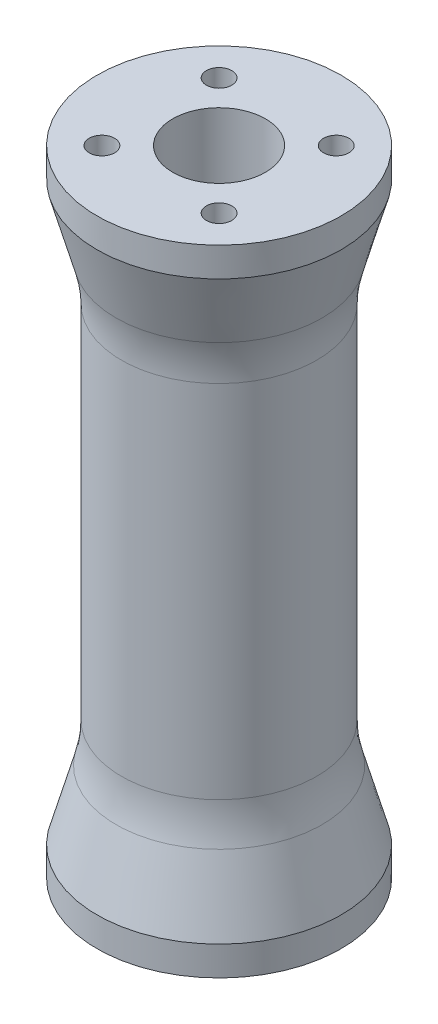
ISO-10303-21;
HEADER;
FILE_DESCRIPTION(('STEP AP214'),'2;1');
FILE_NAME('part.step','',(''),(''),'','','');
FILE_SCHEMA(('AUTOMOTIVE_DESIGN { 1 0 10303 214 1 1 1 1 }'));
ENDSEC;
DATA;
#1=APPLICATION_CONTEXT('core data for automotive mechanical design processes');
#2=APPLICATION_PROTOCOL_DEFINITION('international standard','automotive_design',2000,#1);
#3=PRODUCT_CONTEXT('',#1,'mechanical');
#4=PRODUCT('Part','Part','',(#3));
#5=PRODUCT_RELATED_PRODUCT_CATEGORY('part','',(#4));
#6=PRODUCT_DEFINITION_FORMATION('','',#4);
#7=PRODUCT_DEFINITION_CONTEXT('part definition',#1,'design');
#8=PRODUCT_DEFINITION('design','',#6,#7);
#9=PRODUCT_DEFINITION_SHAPE('','',#8);
#10=(LENGTH_UNIT() NAMED_UNIT(*) SI_UNIT(.MILLI.,.METRE.));
#11=(NAMED_UNIT(*) PLANE_ANGLE_UNIT() SI_UNIT($,.RADIAN.));
#12=(NAMED_UNIT(*) SI_UNIT($,.STERADIAN.) SOLID_ANGLE_UNIT());
#13=UNCERTAINTY_MEASURE_WITH_UNIT(LENGTH_MEASURE(1.E-05),#10,'distance_accuracy_value','');
#14=(GEOMETRIC_REPRESENTATION_CONTEXT(3) GLOBAL_UNCERTAINTY_ASSIGNED_CONTEXT((#13)) GLOBAL_UNIT_ASSIGNED_CONTEXT((#10,
#11,#12)) REPRESENTATION_CONTEXT('',''));
#15=CARTESIAN_POINT('',(0.,0.,0.));
#16=DIRECTION('',(0.,0.,1.));
#17=DIRECTION('',(1.,0.,0.));
#18=AXIS2_PLACEMENT_3D('',#15,#16,#17);
#19=CARTESIAN_POINT('',(0.,32.5,0.));
#20=DIRECTION('',(0.,-1.,0.));
#21=DIRECTION('',(0.,0.,-1.));
#22=AXIS2_PLACEMENT_3D('',#19,#20,#21);
#23=PLANE('',#22);
#24=CARTESIAN_POINT('',(0.,32.5,0.));
#25=DIRECTION('',(0.,1.,0.));
#26=DIRECTION('',(0.,0.,1.));
#27=AXIS2_PLACEMENT_3D('',#24,#25,#26);
#28=CIRCLE('',#27,4.75);
#29=CARTESIAN_POINT('',(0.,32.5,4.75));
#30=VERTEX_POINT('',#29);
#31=EDGE_CURVE('E180',#30,#30,#28,.T.);
#32=ORIENTED_EDGE('',*,*,#31,.F.);
#33=EDGE_LOOP('',(#32));
#34=FACE_BOUND('',#33,.T.);
#35=CARTESIAN_POINT('',(6.,32.5,-6.));
#36=DIRECTION('',(0.,1.,0.));
#37=DIRECTION('',(0.,0.,1.));
#38=AXIS2_PLACEMENT_3D('',#35,#36,#37);
#39=CIRCLE('',#38,1.3);
#40=CARTESIAN_POINT('',(6.,32.5,-4.7));
#41=VERTEX_POINT('',#40);
#42=EDGE_CURVE('E122',#41,#41,#39,.T.);
#43=ORIENTED_EDGE('',*,*,#42,.F.);
#44=EDGE_LOOP('',(#43));
#45=FACE_BOUND('',#44,.T.);
#46=CARTESIAN_POINT('',(-6.,32.5,6.));
#47=DIRECTION('',(0.,1.,0.));
#48=DIRECTION('',(0.,0.,1.));
#49=AXIS2_PLACEMENT_3D('',#46,#47,#48);
#50=CIRCLE('',#49,1.3);
#51=CARTESIAN_POINT('',(-6.,32.5,7.3));
#52=VERTEX_POINT('',#51);
#53=EDGE_CURVE('E129',#52,#52,#50,.T.);
#54=ORIENTED_EDGE('',*,*,#53,.F.);
#55=EDGE_LOOP('',(#54));
#56=FACE_BOUND('',#55,.T.);
#57=CARTESIAN_POINT('',(6.,32.5,6.));
#58=DIRECTION('',(0.,1.,0.));
#59=DIRECTION('',(0.,0.,1.));
#60=AXIS2_PLACEMENT_3D('',#57,#58,#59);
#61=CIRCLE('',#60,1.3);
#62=CARTESIAN_POINT('',(6.,32.5,7.3));
#63=VERTEX_POINT('',#62);
#64=EDGE_CURVE('E130',#63,#63,#61,.T.);
#65=ORIENTED_EDGE('',*,*,#64,.F.);
#66=EDGE_LOOP('',(#65));
#67=FACE_BOUND('',#66,.T.);
#68=CARTESIAN_POINT('',(-6.,32.5,-6.));
#69=DIRECTION('',(0.,1.,0.));
#70=DIRECTION('',(0.,0.,1.));
#71=AXIS2_PLACEMENT_3D('',#68,#69,#70);
#72=CIRCLE('',#71,1.3);
#73=CARTESIAN_POINT('',(-6.,32.5,-4.7));
#74=VERTEX_POINT('',#73);
#75=EDGE_CURVE('E118',#74,#74,#72,.T.);
#76=ORIENTED_EDGE('',*,*,#75,.F.);
#77=EDGE_LOOP('',(#76));
#78=FACE_BOUND('',#77,.T.);
#79=CARTESIAN_POINT('',(0.,32.5,0.));
#80=DIRECTION('',(0.,-1.,0.));
#81=DIRECTION('',(0.,0.,-1.));
#82=AXIS2_PLACEMENT_3D('',#79,#80,#81);
#83=CIRCLE('',#82,12.5);
#84=CARTESIAN_POINT('',(0.,32.5,-12.5));
#85=VERTEX_POINT('',#84);
#86=EDGE_CURVE('E95',#85,#85,#83,.T.);
#87=ORIENTED_EDGE('',*,*,#86,.F.);
#88=EDGE_LOOP('',(#87));
#89=FACE_BOUND('',#88,.T.);
#90=ADVANCED_FACE('F49',(#34,#45,#56,#67,#78,#89),#23,.F.);
#91=CARTESIAN_POINT('',(0.,-32.5,0.));
#92=DIRECTION('',(0.,-1.,0.));
#93=DIRECTION('',(0.,0.,-1.));
#94=AXIS2_PLACEMENT_3D('',#91,#92,#93);
#95=CYLINDRICAL_SURFACE('',#94,12.5);
#96=CARTESIAN_POINT('',(0.,29.5,0.));
#97=DIRECTION('',(0.,-1.,0.));
#98=DIRECTION('',(0.,0.,-1.));
#99=AXIS2_PLACEMENT_3D('',#96,#97,#98);
#100=CIRCLE('',#99,12.5);
#101=CARTESIAN_POINT('',(0.,29.5,-12.5));
#102=VERTEX_POINT('',#101);
#103=EDGE_CURVE('E105',#102,#102,#100,.T.);
#104=ORIENTED_EDGE('',*,*,#103,.F.);
#105=EDGE_LOOP('',(#104));
#106=FACE_BOUND('',#105,.T.);
#107=ORIENTED_EDGE('',*,*,#86,.T.);
#108=EDGE_LOOP('',(#107));
#109=FACE_BOUND('',#108,.T.);
#110=ADVANCED_FACE('F210',(#106,#109),#95,.T.);
#111=CARTESIAN_POINT('',(0.,29.5,0.));
#112=DIRECTION('',(0.,1.,0.));
#113=DIRECTION('',(0.,0.,1.));
#114=AXIS2_PLACEMENT_3D('',#111,#112,#113);
#115=CONICAL_SURFACE('',#114,12.5,0.270946850338424);
#116=CARTESIAN_POINT('',(0.,22.4700328799832,0.));
#117=DIRECTION('',(0.,1.,0.));
#118=DIRECTION('',(0.,0.,1.));
#119=AXIS2_PLACEMENT_3D('',#116,#117,#118);
#120=CIRCLE('',#119,10.5472313555509);
#121=CARTESIAN_POINT('',(0.,22.4700328799832,10.5472313555509));
#122=VERTEX_POINT('',#121);
#123=EDGE_CURVE('E79',#122,#122,#120,.T.);
#124=ORIENTED_EDGE('',*,*,#123,.T.);
#125=EDGE_LOOP('',(#124));
#126=FACE_BOUND('',#125,.T.);
#127=ORIENTED_EDGE('',*,*,#103,.T.);
#128=EDGE_LOOP('',(#127));
#129=FACE_BOUND('',#128,.T.);
#130=ADVANCED_FACE('F215',(#126,#129),#115,.T.);
#131=CARTESIAN_POINT('',(0.,-32.5,0.));
#132=DIRECTION('',(0.,-1.,0.));
#133=DIRECTION('',(0.,0.,-1.));
#134=AXIS2_PLACEMENT_3D('',#131,#132,#133);
#135=CYLINDRICAL_SURFACE('',#134,9.99999999999997);
#136=CARTESIAN_POINT('',(0.,-18.4553749231917,0.));
#137=DIRECTION('',(0.,-1.,0.));
#138=DIRECTION('',(0.,0.,-1.));
#139=AXIS2_PLACEMENT_3D('',#136,#137,#138);
#140=CIRCLE('',#139,9.99999999999997);
#141=CARTESIAN_POINT('',(0.,-18.4553749231917,-9.99999999999997));
#142=VERTEX_POINT('',#141);
#143=EDGE_CURVE('E83',#142,#142,#140,.F.);
#144=ORIENTED_EDGE('',*,*,#143,.T.);
#145=EDGE_LOOP('',(#144));
#146=FACE_BOUND('',#145,.T.);
#147=CARTESIAN_POINT('',(0.,18.4553749231917,0.));
#148=DIRECTION('',(0.,-1.,0.));
#149=DIRECTION('',(0.,0.,-1.));
#150=AXIS2_PLACEMENT_3D('',#147,#148,#149);
#151=CIRCLE('',#150,9.99999999999997);
#152=CARTESIAN_POINT('',(0.,18.4553749231917,-9.99999999999997));
#153=VERTEX_POINT('',#152);
#154=EDGE_CURVE('E87',#153,#153,#151,.T.);
#155=ORIENTED_EDGE('',*,*,#154,.T.);
#156=EDGE_LOOP('',(#155));
#157=FACE_BOUND('',#156,.T.);
#158=ADVANCED_FACE('F292',(#146,#157),#135,.T.);
#159=CARTESIAN_POINT('',(0.,-20.5,0.));
#160=DIRECTION('',(0.,-1.,0.));
#161=DIRECTION('',(0.,0.,-1.));
#162=AXIS2_PLACEMENT_3D('',#159,#160,#161);
#163=CONICAL_SURFACE('',#162,9.99999999999997,0.270946850338424);
#164=CARTESIAN_POINT('',(0.,-22.4700328799832,0.));
#165=DIRECTION('',(0.,-1.,0.));
#166=DIRECTION('',(0.,0.,-1.));
#167=AXIS2_PLACEMENT_3D('',#164,#165,#166);
#168=CIRCLE('',#167,10.5472313555509);
#169=CARTESIAN_POINT('',(0.,-22.4700328799832,-10.5472313555509));
#170=VERTEX_POINT('',#169);
#171=EDGE_CURVE('E91',#170,#170,#168,.T.);
#172=ORIENTED_EDGE('',*,*,#171,.T.);
#173=EDGE_LOOP('',(#172));
#174=FACE_BOUND('',#173,.T.);
#175=CARTESIAN_POINT('',(0.,-29.5,0.));
#176=DIRECTION('',(0.,-1.,0.));
#177=DIRECTION('',(0.,0.,-1.));
#178=AXIS2_PLACEMENT_3D('',#175,#176,#177);
#179=CIRCLE('',#178,12.5);
#180=CARTESIAN_POINT('',(0.,-29.5,-12.5));
#181=VERTEX_POINT('',#180);
#182=EDGE_CURVE('E109',#181,#181,#179,.T.);
#183=ORIENTED_EDGE('',*,*,#182,.F.);
#184=EDGE_LOOP('',(#183));
#185=FACE_BOUND('',#184,.T.);
#186=ADVANCED_FACE('F286',(#174,#185),#163,.T.);
#187=CARTESIAN_POINT('',(0.,-32.5,0.));
#188=DIRECTION('',(0.,-1.,0.));
#189=DIRECTION('',(0.,0.,-1.));
#190=AXIS2_PLACEMENT_3D('',#187,#188,#189);
#191=CYLINDRICAL_SURFACE('',#190,12.5);
#192=CARTESIAN_POINT('',(0.,-32.5,0.));
#193=DIRECTION('',(0.,-1.,0.));
#194=DIRECTION('',(0.,0.,-1.));
#195=AXIS2_PLACEMENT_3D('',#192,#193,#194);
#196=CIRCLE('',#195,12.5);
#197=CARTESIAN_POINT('',(0.,-32.5,-12.5));
#198=VERTEX_POINT('',#197);
#199=EDGE_CURVE('E113',#198,#198,#196,.T.);
#200=ORIENTED_EDGE('',*,*,#199,.F.);
#201=EDGE_LOOP('',(#200));
#202=FACE_BOUND('',#201,.T.);
#203=ORIENTED_EDGE('',*,*,#182,.T.);
#204=EDGE_LOOP('',(#203));
#205=FACE_BOUND('',#204,.T.);
#206=ADVANCED_FACE('F291',(#202,#205),#191,.T.);
#207=CARTESIAN_POINT('',(0.,-32.5,0.));
#208=DIRECTION('',(0.,1.,0.));
#209=DIRECTION('',(0.,0.,1.));
#210=AXIS2_PLACEMENT_3D('',#207,#208,#209);
#211=PLANE('',#210);
#212=CARTESIAN_POINT('',(0.,-32.5,0.));
#213=DIRECTION('',(0.,1.,0.));
#214=DIRECTION('',(0.,0.,1.));
#215=AXIS2_PLACEMENT_3D('',#212,#213,#214);
#216=CIRCLE('',#215,4.75);
#217=CARTESIAN_POINT('',(0.,-32.5,4.75));
#218=VERTEX_POINT('',#217);
#219=EDGE_CURVE('E101',#218,#218,#216,.T.);
#220=ORIENTED_EDGE('',*,*,#219,.T.);
#221=EDGE_LOOP('',(#220));
#222=FACE_BOUND('',#221,.T.);
#223=CARTESIAN_POINT('',(6.,-32.5,-6.));
#224=DIRECTION('',(0.,1.,0.));
#225=DIRECTION('',(0.,0.,1.));
#226=AXIS2_PLACEMENT_3D('',#223,#224,#225);
#227=CIRCLE('',#226,1.3);
#228=CARTESIAN_POINT('',(6.,-32.5,-4.7));
#229=VERTEX_POINT('',#228);
#230=EDGE_CURVE('E165',#229,#229,#227,.T.);
#231=ORIENTED_EDGE('',*,*,#230,.T.);
#232=EDGE_LOOP('',(#231));
#233=FACE_BOUND('',#232,.T.);
#234=CARTESIAN_POINT('',(-6.,-32.5,6.));
#235=DIRECTION('',(0.,1.,0.));
#236=DIRECTION('',(0.,0.,1.));
#237=AXIS2_PLACEMENT_3D('',#234,#235,#236);
#238=CIRCLE('',#237,1.3);
#239=CARTESIAN_POINT('',(-6.,-32.5,7.3));
#240=VERTEX_POINT('',#239);
#241=EDGE_CURVE('E157',#240,#240,#238,.T.);
#242=ORIENTED_EDGE('',*,*,#241,.T.);
#243=EDGE_LOOP('',(#242));
#244=FACE_BOUND('',#243,.T.);
#245=CARTESIAN_POINT('',(6.,-32.5,6.));
#246=DIRECTION('',(0.,1.,0.));
#247=DIRECTION('',(0.,0.,1.));
#248=AXIS2_PLACEMENT_3D('',#245,#246,#247);
#249=CIRCLE('',#248,1.3);
#250=CARTESIAN_POINT('',(6.,-32.5,7.3));
#251=VERTEX_POINT('',#250);
#252=EDGE_CURVE('E171',#251,#251,#249,.T.);
#253=ORIENTED_EDGE('',*,*,#252,.T.);
#254=EDGE_LOOP('',(#253));
#255=FACE_BOUND('',#254,.T.);
#256=CARTESIAN_POINT('',(-6.,-32.5,-6.));
#257=DIRECTION('',(0.,1.,0.));
#258=DIRECTION('',(0.,0.,1.));
#259=AXIS2_PLACEMENT_3D('',#256,#257,#258);
#260=CIRCLE('',#259,1.3);
#261=CARTESIAN_POINT('',(-6.,-32.5,-4.7));
#262=VERTEX_POINT('',#261);
#263=EDGE_CURVE('E149',#262,#262,#260,.T.);
#264=ORIENTED_EDGE('',*,*,#263,.T.);
#265=EDGE_LOOP('',(#264));
#266=FACE_BOUND('',#265,.T.);
#267=ORIENTED_EDGE('',*,*,#199,.T.);
#268=EDGE_LOOP('',(#267));
#269=FACE_BOUND('',#268,.T.);
#270=ADVANCED_FACE('F189',(#222,#233,#244,#255,#266,#269),#211,.F.);
#271=CARTESIAN_POINT('',(-6.,25.5,-6.));
#272=DIRECTION('',(0.,1.,0.));
#273=DIRECTION('',(0.,0.,1.));
#274=AXIS2_PLACEMENT_3D('',#271,#272,#273);
#275=CYLINDRICAL_SURFACE('',#274,1.3);
#276=CARTESIAN_POINT('',(-6.,25.5,-6.));
#277=DIRECTION('',(0.,1.,0.));
#278=DIRECTION('',(0.,0.,1.));
#279=AXIS2_PLACEMENT_3D('',#276,#277,#278);
#280=CIRCLE('',#279,1.3);
#281=CARTESIAN_POINT('',(-6.,25.5,-4.7));
#282=VERTEX_POINT('',#281);
#283=EDGE_CURVE('E117',#282,#282,#280,.T.);
#284=ORIENTED_EDGE('',*,*,#283,.F.);
#285=EDGE_LOOP('',(#284));
#286=FACE_BOUND('',#285,.T.);
#287=ORIENTED_EDGE('',*,*,#75,.T.);
#288=EDGE_LOOP('',(#287));
#289=FACE_BOUND('',#288,.T.);
#290=ADVANCED_FACE('F335',(#286,#289),#275,.F.);
#291=CARTESIAN_POINT('',(-6.,25.5,-6.));
#292=DIRECTION('',(0.,1.,0.));
#293=DIRECTION('',(0.,0.,1.));
#294=AXIS2_PLACEMENT_3D('',#291,#292,#293);
#295=PLANE('',#294);
#296=ORIENTED_EDGE('',*,*,#283,.T.);
#297=EDGE_LOOP('',(#296));
#298=FACE_BOUND('',#297,.T.);
#299=ADVANCED_FACE('F479',(#298),#295,.T.);
#300=CARTESIAN_POINT('',(6.,25.5,6.));
#301=DIRECTION('',(0.,1.,0.));
#302=DIRECTION('',(0.,0.,1.));
#303=AXIS2_PLACEMENT_3D('',#300,#301,#302);
#304=CYLINDRICAL_SURFACE('',#303,1.3);
#305=CARTESIAN_POINT('',(6.,25.5,6.));
#306=DIRECTION('',(0.,1.,0.));
#307=DIRECTION('',(0.,0.,1.));
#308=AXIS2_PLACEMENT_3D('',#305,#306,#307);
#309=CIRCLE('',#308,1.3);
#310=CARTESIAN_POINT('',(6.,25.5,7.3));
#311=VERTEX_POINT('',#310);
#312=EDGE_CURVE('E141',#311,#311,#309,.T.);
#313=ORIENTED_EDGE('',*,*,#312,.F.);
#314=EDGE_LOOP('',(#313));
#315=FACE_BOUND('',#314,.T.);
#316=ORIENTED_EDGE('',*,*,#64,.T.);
#317=EDGE_LOOP('',(#316));
#318=FACE_BOUND('',#317,.T.);
#319=ADVANCED_FACE('F469',(#315,#318),#304,.F.);
#320=CARTESIAN_POINT('',(6.,25.5,6.));
#321=DIRECTION('',(0.,1.,0.));
#322=DIRECTION('',(0.,0.,1.));
#323=AXIS2_PLACEMENT_3D('',#320,#321,#322);
#324=PLANE('',#323);
#325=ORIENTED_EDGE('',*,*,#312,.T.);
#326=EDGE_LOOP('',(#325));
#327=FACE_BOUND('',#326,.T.);
#328=ADVANCED_FACE('F459',(#327),#324,.T.);
#329=CARTESIAN_POINT('',(-6.,25.5,6.));
#330=DIRECTION('',(0.,1.,0.));
#331=DIRECTION('',(0.,0.,1.));
#332=AXIS2_PLACEMENT_3D('',#329,#330,#331);
#333=CYLINDRICAL_SURFACE('',#332,1.3);
#334=CARTESIAN_POINT('',(-6.,25.5,6.));
#335=DIRECTION('',(0.,1.,0.));
#336=DIRECTION('',(0.,0.,1.));
#337=AXIS2_PLACEMENT_3D('',#334,#335,#336);
#338=CIRCLE('',#337,1.3);
#339=CARTESIAN_POINT('',(-6.,25.5,7.3));
#340=VERTEX_POINT('',#339);
#341=EDGE_CURVE('E126',#340,#340,#338,.T.);
#342=ORIENTED_EDGE('',*,*,#341,.F.);
#343=EDGE_LOOP('',(#342));
#344=FACE_BOUND('',#343,.T.);
#345=ORIENTED_EDGE('',*,*,#53,.T.);
#346=EDGE_LOOP('',(#345));
#347=FACE_BOUND('',#346,.T.);
#348=ADVANCED_FACE('F449',(#344,#347),#333,.F.);
#349=CARTESIAN_POINT('',(-6.,25.5,6.));
#350=DIRECTION('',(0.,1.,0.));
#351=DIRECTION('',(0.,0.,1.));
#352=AXIS2_PLACEMENT_3D('',#349,#350,#351);
#353=PLANE('',#352);
#354=ORIENTED_EDGE('',*,*,#341,.T.);
#355=EDGE_LOOP('',(#354));
#356=FACE_BOUND('',#355,.T.);
#357=ADVANCED_FACE('F439',(#356),#353,.T.);
#358=CARTESIAN_POINT('',(6.,25.5,-6.));
#359=DIRECTION('',(0.,1.,0.));
#360=DIRECTION('',(0.,0.,1.));
#361=AXIS2_PLACEMENT_3D('',#358,#359,#360);
#362=CYLINDRICAL_SURFACE('',#361,1.3);
#363=CARTESIAN_POINT('',(6.,25.5,-6.));
#364=DIRECTION('',(0.,1.,0.));
#365=DIRECTION('',(0.,0.,1.));
#366=AXIS2_PLACEMENT_3D('',#363,#364,#365);
#367=CIRCLE('',#366,1.3);
#368=CARTESIAN_POINT('',(6.,25.5,-4.7));
#369=VERTEX_POINT('',#368);
#370=EDGE_CURVE('E134',#369,#369,#367,.T.);
#371=ORIENTED_EDGE('',*,*,#370,.F.);
#372=EDGE_LOOP('',(#371));
#373=FACE_BOUND('',#372,.T.);
#374=ORIENTED_EDGE('',*,*,#42,.T.);
#375=EDGE_LOOP('',(#374));
#376=FACE_BOUND('',#375,.T.);
#377=ADVANCED_FACE('F429',(#373,#376),#362,.F.);
#378=CARTESIAN_POINT('',(6.,25.5,-6.));
#379=DIRECTION('',(0.,1.,0.));
#380=DIRECTION('',(0.,0.,1.));
#381=AXIS2_PLACEMENT_3D('',#378,#379,#380);
#382=PLANE('',#381);
#383=ORIENTED_EDGE('',*,*,#370,.T.);
#384=EDGE_LOOP('',(#383));
#385=FACE_BOUND('',#384,.T.);
#386=ADVANCED_FACE('F419',(#385),#382,.T.);
#387=CARTESIAN_POINT('',(-6.,-25.5,-6.));
#388=DIRECTION('',(0.,-1.,0.));
#389=DIRECTION('',(0.,0.,-1.));
#390=AXIS2_PLACEMENT_3D('',#387,#388,#389);
#391=CYLINDRICAL_SURFACE('',#390,1.3);
#392=CARTESIAN_POINT('',(-6.,-25.5,-6.));
#393=DIRECTION('',(0.,1.,0.));
#394=DIRECTION('',(0.,0.,1.));
#395=AXIS2_PLACEMENT_3D('',#392,#393,#394);
#396=CIRCLE('',#395,1.3);
#397=CARTESIAN_POINT('',(-6.,-25.5,-4.7));
#398=VERTEX_POINT('',#397);
#399=EDGE_CURVE('E145',#398,#398,#396,.T.);
#400=ORIENTED_EDGE('',*,*,#399,.T.);
#401=EDGE_LOOP('',(#400));
#402=FACE_BOUND('',#401,.T.);
#403=ORIENTED_EDGE('',*,*,#263,.F.);
#404=EDGE_LOOP('',(#403));
#405=FACE_BOUND('',#404,.T.);
#406=ADVANCED_FACE('F409',(#402,#405),#391,.F.);
#407=CARTESIAN_POINT('',(-6.,-25.5,-6.));
#408=DIRECTION('',(0.,-1.,0.));
#409=DIRECTION('',(0.,0.,1.));
#410=AXIS2_PLACEMENT_3D('',#407,#408,#409);
#411=PLANE('',#410);
#412=ORIENTED_EDGE('',*,*,#399,.F.);
#413=EDGE_LOOP('',(#412));
#414=FACE_BOUND('',#413,.T.);
#415=ADVANCED_FACE('F399',(#414),#411,.T.);
#416=CARTESIAN_POINT('',(6.,-25.5,6.));
#417=DIRECTION('',(0.,-1.,0.));
#418=DIRECTION('',(0.,0.,-1.));
#419=AXIS2_PLACEMENT_3D('',#416,#417,#418);
#420=CYLINDRICAL_SURFACE('',#419,1.3);
#421=CARTESIAN_POINT('',(6.,-25.5,6.));
#422=DIRECTION('',(0.,1.,0.));
#423=DIRECTION('',(0.,0.,1.));
#424=AXIS2_PLACEMENT_3D('',#421,#422,#423);
#425=CIRCLE('',#424,1.3);
#426=CARTESIAN_POINT('',(6.,-25.5,7.3));
#427=VERTEX_POINT('',#426);
#428=EDGE_CURVE('E162',#427,#427,#425,.T.);
#429=ORIENTED_EDGE('',*,*,#428,.T.);
#430=EDGE_LOOP('',(#429));
#431=FACE_BOUND('',#430,.T.);
#432=ORIENTED_EDGE('',*,*,#252,.F.);
#433=EDGE_LOOP('',(#432));
#434=FACE_BOUND('',#433,.T.);
#435=ADVANCED_FACE('F390',(#431,#434),#420,.F.);
#436=CARTESIAN_POINT('',(6.,-25.5,6.));
#437=DIRECTION('',(0.,-1.,0.));
#438=DIRECTION('',(0.,0.,1.));
#439=AXIS2_PLACEMENT_3D('',#436,#437,#438);
#440=PLANE('',#439);
#441=ORIENTED_EDGE('',*,*,#428,.F.);
#442=EDGE_LOOP('',(#441));
#443=FACE_BOUND('',#442,.T.);
#444=ADVANCED_FACE('F380',(#443),#440,.T.);
#445=CARTESIAN_POINT('',(-6.,-25.5,6.));
#446=DIRECTION('',(0.,-1.,0.));
#447=DIRECTION('',(0.,0.,-1.));
#448=AXIS2_PLACEMENT_3D('',#445,#446,#447);
#449=CYLINDRICAL_SURFACE('',#448,1.3);
#450=CARTESIAN_POINT('',(-6.,-25.5,6.));
#451=DIRECTION('',(0.,1.,0.));
#452=DIRECTION('',(0.,0.,1.));
#453=AXIS2_PLACEMENT_3D('',#450,#451,#452);
#454=CIRCLE('',#453,1.3);
#455=CARTESIAN_POINT('',(-6.,-25.5,7.3));
#456=VERTEX_POINT('',#455);
#457=EDGE_CURVE('E161',#456,#456,#454,.T.);
#458=ORIENTED_EDGE('',*,*,#457,.T.);
#459=EDGE_LOOP('',(#458));
#460=FACE_BOUND('',#459,.T.);
#461=ORIENTED_EDGE('',*,*,#241,.F.);
#462=EDGE_LOOP('',(#461));
#463=FACE_BOUND('',#462,.T.);
#464=ADVANCED_FACE('F370',(#460,#463),#449,.F.);
#465=CARTESIAN_POINT('',(-6.,-25.5,6.));
#466=DIRECTION('',(0.,-1.,0.));
#467=DIRECTION('',(0.,0.,1.));
#468=AXIS2_PLACEMENT_3D('',#465,#466,#467);
#469=PLANE('',#468);
#470=ORIENTED_EDGE('',*,*,#457,.F.);
#471=EDGE_LOOP('',(#470));
#472=FACE_BOUND('',#471,.T.);
#473=ADVANCED_FACE('F360',(#472),#469,.T.);
#474=CARTESIAN_POINT('',(6.,-25.5,-6.));
#475=DIRECTION('',(0.,-1.,0.));
#476=DIRECTION('',(0.,0.,-1.));
#477=AXIS2_PLACEMENT_3D('',#474,#475,#476);
#478=CYLINDRICAL_SURFACE('',#477,1.3);
#479=CARTESIAN_POINT('',(6.,-25.5,-6.));
#480=DIRECTION('',(0.,1.,0.));
#481=DIRECTION('',(0.,0.,1.));
#482=AXIS2_PLACEMENT_3D('',#479,#480,#481);
#483=CIRCLE('',#482,1.3);
#484=CARTESIAN_POINT('',(6.,-25.5,-4.7));
#485=VERTEX_POINT('',#484);
#486=EDGE_CURVE('E153',#485,#485,#483,.T.);
#487=ORIENTED_EDGE('',*,*,#486,.T.);
#488=EDGE_LOOP('',(#487));
#489=FACE_BOUND('',#488,.T.);
#490=ORIENTED_EDGE('',*,*,#230,.F.);
#491=EDGE_LOOP('',(#490));
#492=FACE_BOUND('',#491,.T.);
#493=ADVANCED_FACE('F350',(#489,#492),#478,.F.);
#494=CARTESIAN_POINT('',(6.,-25.5,-6.));
#495=DIRECTION('',(0.,-1.,0.));
#496=DIRECTION('',(0.,0.,1.));
#497=AXIS2_PLACEMENT_3D('',#494,#495,#496);
#498=PLANE('',#497);
#499=ORIENTED_EDGE('',*,*,#486,.F.);
#500=EDGE_LOOP('',(#499));
#501=FACE_BOUND('',#500,.T.);
#502=ADVANCED_FACE('F326',(#501),#498,.T.);
#503=CARTESIAN_POINT('',(0.,-32.5,0.));
#504=DIRECTION('',(0.,1.,0.));
#505=DIRECTION('',(0.,0.,1.));
#506=AXIS2_PLACEMENT_3D('',#503,#504,#505);
#507=CYLINDRICAL_SURFACE('',#506,4.75);
#508=ORIENTED_EDGE('',*,*,#31,.T.);
#509=EDGE_LOOP('',(#508));
#510=FACE_BOUND('',#509,.T.);
#511=CARTESIAN_POINT('',(0.,24.95,0.));
#512=DIRECTION('',(0.,-1.,0.));
#513=DIRECTION('',(1.,0.,0.));
#514=AXIS2_PLACEMENT_3D('',#511,#512,#513);
#515=CIRCLE('',#514,4.75);
#516=CARTESIAN_POINT('',(4.75,24.95,0.));
#517=VERTEX_POINT('',#516);
#518=EDGE_CURVE('E96',#517,#517,#515,.F.);
#519=ORIENTED_EDGE('',*,*,#518,.F.);
#520=EDGE_LOOP('',(#519));
#521=FACE_BOUND('',#520,.T.);
#522=ADVANCED_FACE('F196',(#510,#521),#507,.F.);
#523=ORIENTED_EDGE('',*,*,#219,.F.);
#524=EDGE_LOOP('',(#523));
#525=FACE_BOUND('',#524,.T.);
#526=CARTESIAN_POINT('',(0.,-24.95,0.));
#527=DIRECTION('',(0.,1.,0.));
#528=DIRECTION('',(-1.,0.,0.));
#529=AXIS2_PLACEMENT_3D('',#526,#527,#528);
#530=CIRCLE('',#529,4.75);
#531=CARTESIAN_POINT('',(-4.74999999999999,-24.95,0.));
#532=VERTEX_POINT('',#531);
#533=EDGE_CURVE('E100',#532,#532,#530,.F.);
#534=ORIENTED_EDGE('',*,*,#533,.F.);
#535=EDGE_LOOP('',(#534));
#536=FACE_BOUND('',#535,.T.);
#537=ADVANCED_FACE('F192',(#525,#536),#507,.F.);
#538=CARTESIAN_POINT('',(0.,-20.7,0.));
#539=DIRECTION('',(0.,1.,0.));
#540=DIRECTION('',(-1.,0.,0.));
#541=AXIS2_PLACEMENT_3D('',#538,#539,#540);
#542=CONICAL_SURFACE('',#541,8.99999999999997,0.785398163397446);
#543=CARTESIAN_POINT('',(0.,-21.8715728752538,0.));
#544=DIRECTION('',(0.,1.,0.));
#545=DIRECTION('',(-1.,0.,0.));
#546=AXIS2_PLACEMENT_3D('',#543,#544,#545);
#547=CIRCLE('',#546,7.82842712474617);
#548=CARTESIAN_POINT('',(-7.82842712474616,-21.8715728752538,0.));
#549=VERTEX_POINT('',#548);
#550=EDGE_CURVE('E73',#549,#549,#547,.T.);
#551=ORIENTED_EDGE('',*,*,#550,.T.);
#552=EDGE_LOOP('',(#551));
#553=FACE_BOUND('',#552,.T.);
#554=ORIENTED_EDGE('',*,*,#533,.T.);
#555=EDGE_LOOP('',(#554));
#556=FACE_BOUND('',#555,.T.);
#557=ADVANCED_FACE('F195',(#553,#556),#542,.F.);
#558=CARTESIAN_POINT('',(0.,29.7,0.));
#559=DIRECTION('',(0.,1.,0.));
#560=DIRECTION('',(-1.,0.,0.));
#561=AXIS2_PLACEMENT_3D('',#558,#559,#560);
#562=CYLINDRICAL_SURFACE('',#561,8.99999999999997);
#563=CARTESIAN_POINT('',(0.,-19.0431457505076,0.));
#564=DIRECTION('',(0.,1.,0.));
#565=DIRECTION('',(-1.,0.,0.));
#566=AXIS2_PLACEMENT_3D('',#563,#564,#565);
#567=CIRCLE('',#566,8.99999999999997);
#568=CARTESIAN_POINT('',(-8.99999999999996,-19.0431457505076,0.));
#569=VERTEX_POINT('',#568);
#570=EDGE_CURVE('E57',#569,#569,#567,.F.);
#571=ORIENTED_EDGE('',*,*,#570,.T.);
#572=EDGE_LOOP('',(#571));
#573=FACE_BOUND('',#572,.T.);
#574=CARTESIAN_POINT('',(0.,19.0431457505076,0.));
#575=DIRECTION('',(0.,1.,0.));
#576=DIRECTION('',(-1.,0.,0.));
#577=AXIS2_PLACEMENT_3D('',#574,#575,#576);
#578=CIRCLE('',#577,8.99999999999997);
#579=CARTESIAN_POINT('',(-8.99999999999997,19.0431457505076,0.));
#580=VERTEX_POINT('',#579);
#581=EDGE_CURVE('E65',#580,#580,#578,.T.);
#582=ORIENTED_EDGE('',*,*,#581,.T.);
#583=EDGE_LOOP('',(#582));
#584=FACE_BOUND('',#583,.T.);
#585=ADVANCED_FACE('F201',(#573,#584),#562,.F.);
#586=CARTESIAN_POINT('',(0.,29.7,0.));
#587=DIRECTION('',(0.,-1.,0.));
#588=DIRECTION('',(1.,0.,0.));
#589=AXIS2_PLACEMENT_3D('',#586,#587,#588);
#590=CONICAL_SURFACE('',#589,0.,0.785398163397446);
#591=CARTESIAN_POINT('',(0.,21.8715728752538,0.));
#592=DIRECTION('',(0.,-1.,0.));
#593=DIRECTION('',(1.,0.,0.));
#594=AXIS2_PLACEMENT_3D('',#591,#592,#593);
#595=CIRCLE('',#594,7.82842712474617);
#596=CARTESIAN_POINT('',(7.82842712474617,21.8715728752538,0.));
#597=VERTEX_POINT('',#596);
#598=EDGE_CURVE('E10',#597,#597,#595,.T.);
#599=ORIENTED_EDGE('',*,*,#598,.T.);
#600=EDGE_LOOP('',(#599));
#601=FACE_BOUND('',#600,.T.);
#602=ORIENTED_EDGE('',*,*,#518,.T.);
#603=EDGE_LOOP('',(#602));
#604=FACE_BOUND('',#603,.T.);
#605=ADVANCED_FACE('F206',(#601,#604),#590,.F.);
#606=CARTESIAN_POINT('',(0.,-18.4553749231917,0.));
#607=DIRECTION('',(0.,-1.,0.));
#608=DIRECTION('',(0.,0.,-1.));
#609=AXIS2_PLACEMENT_3D('',#606,#607,#608);
#610=TOROIDAL_SURFACE('',#609,25.,15.);
#611=ORIENTED_EDGE('',*,*,#143,.F.);
#612=EDGE_LOOP('',(#611));
#613=FACE_BOUND('',#612,.T.);
#614=ORIENTED_EDGE('',*,*,#171,.F.);
#615=EDGE_LOOP('',(#614));
#616=FACE_BOUND('',#615,.T.);
#617=ADVANCED_FACE('F222',(#613,#616),#610,.F.);
#618=CARTESIAN_POINT('',(0.,18.4553749231917,0.));
#619=DIRECTION('',(0.,-1.,0.));
#620=DIRECTION('',(0.,0.,-1.));
#621=AXIS2_PLACEMENT_3D('',#618,#619,#620);
#622=TOROIDAL_SURFACE('',#621,25.,15.);
#623=ORIENTED_EDGE('',*,*,#123,.F.);
#624=EDGE_LOOP('',(#623));
#625=FACE_BOUND('',#624,.T.);
#626=ORIENTED_EDGE('',*,*,#154,.F.);
#627=EDGE_LOOP('',(#626));
#628=FACE_BOUND('',#627,.T.);
#629=ADVANCED_FACE('F225',(#625,#628),#622,.F.);
#630=CARTESIAN_POINT('',(0.,-19.0431457505076,0.));
#631=DIRECTION('',(0.,1.,0.));
#632=DIRECTION('',(-1.,0.,0.));
#633=AXIS2_PLACEMENT_3D('',#630,#631,#632);
#634=TOROIDAL_SURFACE('',#633,4.99999999999997,4.);
#635=ORIENTED_EDGE('',*,*,#570,.F.);
#636=EDGE_LOOP('',(#635));
#637=FACE_BOUND('',#636,.T.);
#638=ORIENTED_EDGE('',*,*,#550,.F.);
#639=EDGE_LOOP('',(#638));
#640=FACE_BOUND('',#639,.T.);
#641=ADVANCED_FACE('F228',(#637,#640),#634,.F.);
#642=CARTESIAN_POINT('',(0.,19.0431457505076,0.));
#643=DIRECTION('',(0.,1.,0.));
#644=DIRECTION('',(-1.,0.,0.));
#645=AXIS2_PLACEMENT_3D('',#642,#643,#644);
#646=TOROIDAL_SURFACE('',#645,4.99999999999997,4.);
#647=ORIENTED_EDGE('',*,*,#598,.F.);
#648=EDGE_LOOP('',(#647));
#649=FACE_BOUND('',#648,.T.);
#650=ORIENTED_EDGE('',*,*,#581,.F.);
#651=EDGE_LOOP('',(#650));
#652=FACE_BOUND('',#651,.T.);
#653=ADVANCED_FACE('F51',(#649,#652),#646,.F.);
#654=CLOSED_SHELL('',(#90,#110,#130,#158,#186,#206,#270,#290,#299,#319,#328,#348,#357,#377,#386,
#406,#415,#435,#444,#464,#473,#493,#502,#522,#537,#557,#585,#605,#617,#629,#641,#653));
#655=MANIFOLD_SOLID_BREP('B2',#654);
#656=ADVANCED_BREP_SHAPE_REPRESENTATION('',(#18,#655),#14);
#657=SHAPE_DEFINITION_REPRESENTATION(#9,#656);
ENDSEC;
END-ISO-10303-21;
